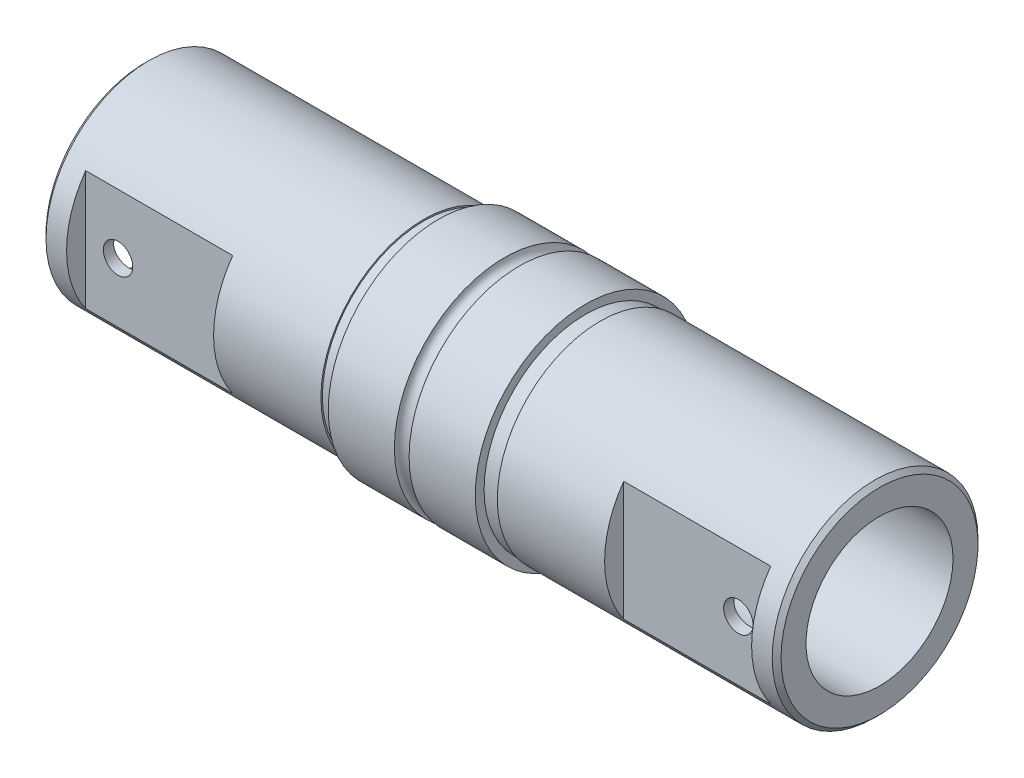
ISO-10303-21;
HEADER;
FILE_DESCRIPTION(('STEP AP214'),'2;1');
FILE_NAME('part.step','',(''),(''),'','','');
FILE_SCHEMA(('AUTOMOTIVE_DESIGN { 1 0 10303 214 1 1 1 1 }'));
ENDSEC;
DATA;
#1=APPLICATION_CONTEXT('core data for automotive mechanical design processes');
#2=APPLICATION_PROTOCOL_DEFINITION('international standard','automotive_design',2000,#1);
#3=PRODUCT_CONTEXT('',#1,'mechanical');
#4=PRODUCT('Part','Part','',(#3));
#5=PRODUCT_RELATED_PRODUCT_CATEGORY('part','',(#4));
#6=PRODUCT_DEFINITION_FORMATION('','',#4);
#7=PRODUCT_DEFINITION_CONTEXT('part definition',#1,'design');
#8=PRODUCT_DEFINITION('design','',#6,#7);
#9=PRODUCT_DEFINITION_SHAPE('','',#8);
#10=(LENGTH_UNIT() NAMED_UNIT(*) SI_UNIT(.MILLI.,.METRE.));
#11=(NAMED_UNIT(*) PLANE_ANGLE_UNIT() SI_UNIT($,.RADIAN.));
#12=(NAMED_UNIT(*) SI_UNIT($,.STERADIAN.) SOLID_ANGLE_UNIT());
#13=UNCERTAINTY_MEASURE_WITH_UNIT(LENGTH_MEASURE(1.E-05),#10,'distance_accuracy_value','');
#14=(GEOMETRIC_REPRESENTATION_CONTEXT(3) GLOBAL_UNCERTAINTY_ASSIGNED_CONTEXT((#13)) GLOBAL_UNIT_ASSIGNED_CONTEXT((#10,
#11,#12)) REPRESENTATION_CONTEXT('',''));
#15=CARTESIAN_POINT('',(0.,0.,0.));
#16=DIRECTION('',(0.,0.,1.));
#17=DIRECTION('',(1.,0.,0.));
#18=AXIS2_PLACEMENT_3D('',#15,#16,#17);
#19=CARTESIAN_POINT('',(-200.,0.,0.));
#20=DIRECTION('',(-1.,0.,0.));
#21=DIRECTION('',(0.,0.,1.));
#22=AXIS2_PLACEMENT_3D('',#19,#20,#21);
#23=CYLINDRICAL_SURFACE('',#22,35.);
#24=CARTESIAN_POINT('',(-30.,0.,0.));
#25=DIRECTION('',(-1.,0.,0.));
#26=DIRECTION('',(0.,0.,1.));
#27=AXIS2_PLACEMENT_3D('',#24,#25,#26);
#28=CIRCLE('',#27,35.);
#29=CARTESIAN_POINT('',(-30.,0.,35.));
#30=VERTEX_POINT('',#29);
#31=EDGE_CURVE('E122',#30,#30,#28,.T.);
#32=ORIENTED_EDGE('',*,*,#31,.T.);
#33=EDGE_LOOP('',(#32));
#34=FACE_BOUND('',#33,.T.);
#35=CARTESIAN_POINT('',(-123.5,0.,0.));
#36=DIRECTION('',(1.,0.,0.));
#37=DIRECTION('',(0.,0.,-1.));
#38=AXIS2_PLACEMENT_3D('',#35,#36,#37);
#39=CIRCLE('',#38,35.);
#40=CARTESIAN_POINT('',(-123.5,0.,-35.));
#41=VERTEX_POINT('',#40);
#42=EDGE_CURVE('E150',#41,#41,#39,.T.);
#43=ORIENTED_EDGE('',*,*,#42,.T.);
#44=EDGE_LOOP('',(#43));
#45=FACE_BOUND('',#44,.T.);
#46=CARTESIAN_POINT('',(-116.5,0.,0.));
#47=DIRECTION('',(-1.,0.,0.));
#48=DIRECTION('',(0.,0.,1.));
#49=AXIS2_PLACEMENT_3D('',#46,#47,#48);
#50=CIRCLE('',#49,35.);
#51=CARTESIAN_POINT('',(-116.5,-20.31624965391,28.5));
#52=VERTEX_POINT('',#51);
#53=CARTESIAN_POINT('',(-116.5,20.31624965391,28.5));
#54=VERTEX_POINT('',#53);
#55=EDGE_CURVE('E97',#52,#54,#50,.T.);
#56=ORIENTED_EDGE('',*,*,#55,.T.);
#57=DIRECTION('',(-1.,0.,0.));
#58=VECTOR('',#57,1.);
#59=CARTESIAN_POINT('',(-200.,20.31624965391,28.5));
#60=LINE('',#59,#58);
#61=CARTESIAN_POINT('',(-66.5,20.31624965391,28.5));
#62=VERTEX_POINT('',#61);
#63=EDGE_CURVE('E11',#62,#54,#60,.T.);
#64=ORIENTED_EDGE('',*,*,#63,.F.);
#65=CARTESIAN_POINT('',(-66.5,0.,0.));
#66=DIRECTION('',(-1.,0.,0.));
#67=DIRECTION('',(0.,0.,1.));
#68=AXIS2_PLACEMENT_3D('',#65,#66,#67);
#69=CIRCLE('',#68,35.);
#70=CARTESIAN_POINT('',(-66.5,-20.31624965391,28.5));
#71=VERTEX_POINT('',#70);
#72=EDGE_CURVE('E95',#71,#62,#69,.T.);
#73=ORIENTED_EDGE('',*,*,#72,.F.);
#74=DIRECTION('',(-1.,0.,0.));
#75=VECTOR('',#74,1.);
#76=CARTESIAN_POINT('',(-200.,-20.31624965391,28.5));
#77=LINE('',#76,#75);
#78=EDGE_CURVE('E41',#52,#71,#77,.F.);
#79=ORIENTED_EDGE('',*,*,#78,.F.);
#80=EDGE_LOOP('',(#56,#64,#73,#79));
#81=FACE_BOUND('',#80,.T.);
#82=ADVANCED_FACE('F33',(#34,#45,#81),#23,.T.);
#83=CARTESIAN_POINT('',(-200.,0.,0.));
#84=DIRECTION('',(-1.,0.,0.));
#85=DIRECTION('',(0.,0.,1.));
#86=AXIS2_PLACEMENT_3D('',#83,#84,#85);
#87=CYLINDRICAL_SURFACE('',#86,35.);
#88=CARTESIAN_POINT('',(30.,0.,0.));
#89=DIRECTION('',(-1.,0.,0.));
#90=DIRECTION('',(0.,0.,1.));
#91=AXIS2_PLACEMENT_3D('',#88,#89,#90);
#92=CIRCLE('',#91,35.);
#93=CARTESIAN_POINT('',(30.,0.,35.));
#94=VERTEX_POINT('',#93);
#95=EDGE_CURVE('E121',#94,#94,#92,.T.);
#96=ORIENTED_EDGE('',*,*,#95,.F.);
#97=EDGE_LOOP('',(#96));
#98=FACE_BOUND('',#97,.T.);
#99=CARTESIAN_POINT('',(123.5,0.,0.));
#100=DIRECTION('',(-1.,0.,0.));
#101=DIRECTION('',(0.,0.,1.));
#102=AXIS2_PLACEMENT_3D('',#99,#100,#101);
#103=CIRCLE('',#102,35.);
#104=CARTESIAN_POINT('',(123.5,0.,35.));
#105=VERTEX_POINT('',#104);
#106=EDGE_CURVE('E153',#105,#105,#103,.T.);
#107=ORIENTED_EDGE('',*,*,#106,.T.);
#108=EDGE_LOOP('',(#107));
#109=FACE_BOUND('',#108,.T.);
#110=DIRECTION('',(-1.,0.,0.));
#111=VECTOR('',#110,1.);
#112=CARTESIAN_POINT('',(-200.,20.31624965391,28.5));
#113=LINE('',#112,#111);
#114=CARTESIAN_POINT('',(66.5,20.31624965391,28.5));
#115=VERTEX_POINT('',#114);
#116=CARTESIAN_POINT('',(116.5,20.31624965391,28.5));
#117=VERTEX_POINT('',#116);
#118=EDGE_CURVE('E83',#115,#117,#113,.F.);
#119=ORIENTED_EDGE('',*,*,#118,.T.);
#120=CARTESIAN_POINT('',(116.5,0.,0.));
#121=DIRECTION('',(-1.,0.,0.));
#122=DIRECTION('',(0.,0.,1.));
#123=AXIS2_PLACEMENT_3D('',#120,#121,#122);
#124=CIRCLE('',#123,35.);
#125=CARTESIAN_POINT('',(116.5,-20.31624965391,28.5));
#126=VERTEX_POINT('',#125);
#127=EDGE_CURVE('E54',#126,#117,#124,.T.);
#128=ORIENTED_EDGE('',*,*,#127,.F.);
#129=DIRECTION('',(-1.,0.,0.));
#130=VECTOR('',#129,1.);
#131=CARTESIAN_POINT('',(-200.,-20.31624965391,28.5));
#132=LINE('',#131,#130);
#133=CARTESIAN_POINT('',(66.5,-20.31624965391,28.5));
#134=VERTEX_POINT('',#133);
#135=EDGE_CURVE('E75',#126,#134,#132,.T.);
#136=ORIENTED_EDGE('',*,*,#135,.T.);
#137=CARTESIAN_POINT('',(66.5,0.,0.));
#138=DIRECTION('',(-1.,0.,0.));
#139=DIRECTION('',(0.,0.,1.));
#140=AXIS2_PLACEMENT_3D('',#137,#138,#139);
#141=CIRCLE('',#140,35.);
#142=EDGE_CURVE('E88',#134,#115,#141,.T.);
#143=ORIENTED_EDGE('',*,*,#142,.T.);
#144=EDGE_LOOP('',(#119,#128,#136,#143));
#145=FACE_BOUND('',#144,.T.);
#146=ADVANCED_FACE('F87',(#98,#109,#145),#87,.T.);
#147=CARTESIAN_POINT('',(-125.,0.,-35.));
#148=DIRECTION('',(1.,0.,0.));
#149=DIRECTION('',(0.,0.,-1.));
#150=AXIS2_PLACEMENT_3D('',#147,#148,#149);
#151=PLANE('',#150);
#152=CARTESIAN_POINT('',(-125.,0.,0.));
#153=DIRECTION('',(1.,0.,0.));
#154=DIRECTION('',(0.,0.,-1.));
#155=AXIS2_PLACEMENT_3D('',#152,#153,#154);
#156=CIRCLE('',#155,25.);
#157=CARTESIAN_POINT('',(-125.,0.,-25.));
#158=VERTEX_POINT('',#157);
#159=EDGE_CURVE('E118',#158,#158,#156,.T.);
#160=ORIENTED_EDGE('',*,*,#159,.T.);
#161=EDGE_LOOP('',(#160));
#162=FACE_BOUND('',#161,.T.);
#163=CARTESIAN_POINT('',(-125.,0.,0.));
#164=DIRECTION('',(1.,0.,0.));
#165=DIRECTION('',(0.,0.,-1.));
#166=AXIS2_PLACEMENT_3D('',#163,#164,#165);
#167=CIRCLE('',#166,33.5000000000001);
#168=CARTESIAN_POINT('',(-125.,0.,-33.5000000000001));
#169=VERTEX_POINT('',#168);
#170=EDGE_CURVE('E147',#169,#169,#167,.F.);
#171=ORIENTED_EDGE('',*,*,#170,.T.);
#172=EDGE_LOOP('',(#171));
#173=FACE_BOUND('',#172,.T.);
#174=ADVANCED_FACE('F191',(#162,#173),#151,.F.);
#175=CARTESIAN_POINT('',(-125.,0.,0.));
#176=DIRECTION('',(1.,0.,0.));
#177=DIRECTION('',(0.,0.,-1.));
#178=AXIS2_PLACEMENT_3D('',#175,#176,#177);
#179=CONICAL_SURFACE('',#178,33.5000000000001,0.785398163397439);
#180=ORIENTED_EDGE('',*,*,#42,.F.);
#181=EDGE_LOOP('',(#180));
#182=FACE_BOUND('',#181,.T.);
#183=ORIENTED_EDGE('',*,*,#170,.F.);
#184=EDGE_LOOP('',(#183));
#185=FACE_BOUND('',#184,.T.);
#186=ADVANCED_FACE('F198',(#182,#185),#179,.T.);
#187=CARTESIAN_POINT('',(-200.,0.,0.));
#188=DIRECTION('',(-1.,0.,0.));
#189=DIRECTION('',(0.,0.,1.));
#190=AXIS2_PLACEMENT_3D('',#187,#188,#189);
#191=CYLINDRICAL_SURFACE('',#190,34.5);
#192=CARTESIAN_POINT('',(-25.,0.,0.));
#193=DIRECTION('',(-1.,0.,0.));
#194=DIRECTION('',(0.,0.,1.));
#195=AXIS2_PLACEMENT_3D('',#192,#193,#194);
#196=CIRCLE('',#195,34.5);
#197=CARTESIAN_POINT('',(-25.,0.,34.5));
#198=VERTEX_POINT('',#197);
#199=EDGE_CURVE('E129',#198,#198,#196,.T.);
#200=ORIENTED_EDGE('',*,*,#199,.T.);
#201=EDGE_LOOP('',(#200));
#202=FACE_BOUND('',#201,.T.);
#203=CARTESIAN_POINT('',(-30.,0.,0.));
#204=DIRECTION('',(-1.,0.,0.));
#205=DIRECTION('',(0.,0.,1.));
#206=AXIS2_PLACEMENT_3D('',#203,#204,#205);
#207=CIRCLE('',#206,34.5);
#208=CARTESIAN_POINT('',(-30.,0.,34.5));
#209=VERTEX_POINT('',#208);
#210=EDGE_CURVE('E125',#209,#209,#207,.T.);
#211=ORIENTED_EDGE('',*,*,#210,.F.);
#212=EDGE_LOOP('',(#211));
#213=FACE_BOUND('',#212,.T.);
#214=ADVANCED_FACE('F211',(#202,#213),#191,.T.);
#215=CARTESIAN_POINT('',(-30.,35.,0.));
#216=DIRECTION('',(1.,0.,0.));
#217=DIRECTION('',(0.,0.,-1.));
#218=AXIS2_PLACEMENT_3D('',#215,#216,#217);
#219=PLANE('',#218);
#220=ORIENTED_EDGE('',*,*,#210,.T.);
#221=EDGE_LOOP('',(#220));
#222=FACE_BOUND('',#221,.T.);
#223=ORIENTED_EDGE('',*,*,#31,.F.);
#224=EDGE_LOOP('',(#223));
#225=FACE_BOUND('',#224,.T.);
#226=ADVANCED_FACE('F177',(#222,#225),#219,.T.);
#227=CARTESIAN_POINT('',(-25.,0.,-37.5));
#228=DIRECTION('',(1.,0.,0.));
#229=DIRECTION('',(0.,0.,-1.));
#230=AXIS2_PLACEMENT_3D('',#227,#228,#229);
#231=PLANE('',#230);
#232=CARTESIAN_POINT('',(-25.,0.,0.));
#233=DIRECTION('',(-1.,0.,0.));
#234=DIRECTION('',(0.,0.,1.));
#235=AXIS2_PLACEMENT_3D('',#232,#233,#234);
#236=CIRCLE('',#235,37.5);
#237=CARTESIAN_POINT('',(-25.,0.,37.5));
#238=VERTEX_POINT('',#237);
#239=EDGE_CURVE('E140',#238,#238,#236,.T.);
#240=ORIENTED_EDGE('',*,*,#239,.T.);
#241=EDGE_LOOP('',(#240));
#242=FACE_BOUND('',#241,.T.);
#243=ORIENTED_EDGE('',*,*,#199,.F.);
#244=EDGE_LOOP('',(#243));
#245=FACE_BOUND('',#244,.T.);
#246=ADVANCED_FACE('F166',(#242,#245),#231,.F.);
#247=CARTESIAN_POINT('',(-200.,0.,0.));
#248=DIRECTION('',(-1.,0.,0.));
#249=DIRECTION('',(0.,0.,1.));
#250=AXIS2_PLACEMENT_3D('',#247,#248,#249);
#251=CYLINDRICAL_SURFACE('',#250,37.5);
#252=ORIENTED_EDGE('',*,*,#239,.F.);
#253=EDGE_LOOP('',(#252));
#254=FACE_BOUND('',#253,.T.);
#255=CARTESIAN_POINT('',(-2.50000000000003,0.,0.));
#256=DIRECTION('',(1.,0.,0.));
#257=DIRECTION('',(0.,0.,-1.));
#258=AXIS2_PLACEMENT_3D('',#255,#256,#257);
#259=CIRCLE('',#258,37.5);
#260=CARTESIAN_POINT('',(-2.50000000000003,0.,-37.5));
#261=VERTEX_POINT('',#260);
#262=EDGE_CURVE('E144',#261,#261,#259,.T.);
#263=ORIENTED_EDGE('',*,*,#262,.F.);
#264=EDGE_LOOP('',(#263));
#265=FACE_BOUND('',#264,.T.);
#266=ADVANCED_FACE('F164',(#254,#265),#251,.T.);
#267=CARTESIAN_POINT('',(0.,0.,0.));
#268=DIRECTION('',(-1.,0.,0.));
#269=DIRECTION('',(0.,0.,1.));
#270=AXIS2_PLACEMENT_3D('',#267,#268,#269);
#271=TOROIDAL_SURFACE('',#270,37.5,2.5);
#272=CARTESIAN_POINT('',(2.49999999999997,0.,0.));
#273=DIRECTION('',(-1.,0.,0.));
#274=DIRECTION('',(0.,0.,1.));
#275=AXIS2_PLACEMENT_3D('',#272,#273,#274);
#276=CIRCLE('',#275,37.5);
#277=CARTESIAN_POINT('',(2.49999999999997,0.,37.5));
#278=VERTEX_POINT('',#277);
#279=EDGE_CURVE('E132',#278,#278,#276,.T.);
#280=ORIENTED_EDGE('',*,*,#279,.T.);
#281=EDGE_LOOP('',(#280));
#282=FACE_BOUND('',#281,.T.);
#283=ORIENTED_EDGE('',*,*,#262,.T.);
#284=EDGE_LOOP('',(#283));
#285=FACE_BOUND('',#284,.T.);
#286=ADVANCED_FACE('F162',(#282,#285),#271,.F.);
#287=CARTESIAN_POINT('',(25.,0.,-37.5));
#288=DIRECTION('',(-1.,0.,0.));
#289=DIRECTION('',(0.,0.,1.));
#290=AXIS2_PLACEMENT_3D('',#287,#288,#289);
#291=PLANE('',#290);
#292=CARTESIAN_POINT('',(25.,0.,0.));
#293=DIRECTION('',(-1.,0.,0.));
#294=DIRECTION('',(0.,0.,1.));
#295=AXIS2_PLACEMENT_3D('',#292,#293,#294);
#296=CIRCLE('',#295,37.5);
#297=CARTESIAN_POINT('',(25.,0.,37.5));
#298=VERTEX_POINT('',#297);
#299=EDGE_CURVE('E143',#298,#298,#296,.T.);
#300=ORIENTED_EDGE('',*,*,#299,.F.);
#301=EDGE_LOOP('',(#300));
#302=FACE_BOUND('',#301,.T.);
#303=CARTESIAN_POINT('',(25.,0.,0.));
#304=DIRECTION('',(-1.,0.,0.));
#305=DIRECTION('',(0.,0.,1.));
#306=AXIS2_PLACEMENT_3D('',#303,#304,#305);
#307=CIRCLE('',#306,34.5);
#308=CARTESIAN_POINT('',(25.,0.,34.5));
#309=VERTEX_POINT('',#308);
#310=EDGE_CURVE('E126',#309,#309,#307,.T.);
#311=ORIENTED_EDGE('',*,*,#310,.T.);
#312=EDGE_LOOP('',(#311));
#313=FACE_BOUND('',#312,.T.);
#314=ADVANCED_FACE('F174',(#302,#313),#291,.F.);
#315=ORIENTED_EDGE('',*,*,#299,.T.);
#316=EDGE_LOOP('',(#315));
#317=FACE_BOUND('',#316,.T.);
#318=ORIENTED_EDGE('',*,*,#279,.F.);
#319=EDGE_LOOP('',(#318));
#320=FACE_BOUND('',#319,.T.);
#321=ADVANCED_FACE('F169',(#317,#320),#251,.T.);
#322=CARTESIAN_POINT('',(-200.,0.,0.));
#323=DIRECTION('',(-1.,0.,0.));
#324=DIRECTION('',(0.,0.,1.));
#325=AXIS2_PLACEMENT_3D('',#322,#323,#324);
#326=CYLINDRICAL_SURFACE('',#325,34.5);
#327=CARTESIAN_POINT('',(30.,0.,0.));
#328=DIRECTION('',(-1.,0.,0.));
#329=DIRECTION('',(0.,0.,1.));
#330=AXIS2_PLACEMENT_3D('',#327,#328,#329);
#331=CIRCLE('',#330,34.5);
#332=CARTESIAN_POINT('',(30.,0.,34.5));
#333=VERTEX_POINT('',#332);
#334=EDGE_CURVE('E135',#333,#333,#331,.T.);
#335=ORIENTED_EDGE('',*,*,#334,.T.);
#336=EDGE_LOOP('',(#335));
#337=FACE_BOUND('',#336,.T.);
#338=ORIENTED_EDGE('',*,*,#310,.F.);
#339=EDGE_LOOP('',(#338));
#340=FACE_BOUND('',#339,.T.);
#341=ADVANCED_FACE('F183',(#337,#340),#326,.T.);
#342=CARTESIAN_POINT('',(30.,35.,0.));
#343=DIRECTION('',(-1.,0.,0.));
#344=DIRECTION('',(0.,0.,1.));
#345=AXIS2_PLACEMENT_3D('',#342,#343,#344);
#346=PLANE('',#345);
#347=ORIENTED_EDGE('',*,*,#95,.T.);
#348=EDGE_LOOP('',(#347));
#349=FACE_BOUND('',#348,.T.);
#350=ORIENTED_EDGE('',*,*,#334,.F.);
#351=EDGE_LOOP('',(#350));
#352=FACE_BOUND('',#351,.T.);
#353=ADVANCED_FACE('F202',(#349,#352),#346,.T.);
#354=CARTESIAN_POINT('',(125.,0.,-35.));
#355=DIRECTION('',(-1.,0.,0.));
#356=DIRECTION('',(0.,0.,1.));
#357=AXIS2_PLACEMENT_3D('',#354,#355,#356);
#358=PLANE('',#357);
#359=CARTESIAN_POINT('',(125.,0.,0.));
#360=DIRECTION('',(1.,0.,0.));
#361=DIRECTION('',(0.,0.,-1.));
#362=AXIS2_PLACEMENT_3D('',#359,#360,#361);
#363=CIRCLE('',#362,25.);
#364=CARTESIAN_POINT('',(125.,0.,-25.));
#365=VERTEX_POINT('',#364);
#366=EDGE_CURVE('E115',#365,#365,#363,.T.);
#367=ORIENTED_EDGE('',*,*,#366,.F.);
#368=EDGE_LOOP('',(#367));
#369=FACE_BOUND('',#368,.T.);
#370=CARTESIAN_POINT('',(125.,0.,0.));
#371=DIRECTION('',(-1.,0.,0.));
#372=DIRECTION('',(0.,0.,1.));
#373=AXIS2_PLACEMENT_3D('',#370,#371,#372);
#374=CIRCLE('',#373,33.5);
#375=CARTESIAN_POINT('',(125.,0.,33.5));
#376=VERTEX_POINT('',#375);
#377=EDGE_CURVE('E90',#376,#376,#374,.F.);
#378=ORIENTED_EDGE('',*,*,#377,.T.);
#379=EDGE_LOOP('',(#378));
#380=FACE_BOUND('',#379,.T.);
#381=ADVANCED_FACE('F200',(#369,#380),#358,.F.);
#382=CARTESIAN_POINT('',(123.5,0.,0.));
#383=DIRECTION('',(-1.,0.,0.));
#384=DIRECTION('',(0.,0.,1.));
#385=AXIS2_PLACEMENT_3D('',#382,#383,#384);
#386=CONICAL_SURFACE('',#385,35.,0.785398163397439);
#387=ORIENTED_EDGE('',*,*,#377,.F.);
#388=EDGE_LOOP('',(#387));
#389=FACE_BOUND('',#388,.T.);
#390=ORIENTED_EDGE('',*,*,#106,.F.);
#391=EDGE_LOOP('',(#390));
#392=FACE_BOUND('',#391,.T.);
#393=ADVANCED_FACE('F35',(#389,#392),#386,.T.);
#394=CARTESIAN_POINT('',(-175.,0.,0.));
#395=DIRECTION('',(1.,0.,0.));
#396=DIRECTION('',(0.,0.,-1.));
#397=AXIS2_PLACEMENT_3D('',#394,#395,#396);
#398=CYLINDRICAL_SURFACE('',#397,25.);
#399=CARTESIAN_POINT('',(-100.5,0.,25.));
#400=CARTESIAN_POINT('',(-100.499997230554,0.138987493787324,25.0000014065203));
#401=CARTESIAN_POINT('',(-100.505796750719,0.277940302046088,24.9988389427216));
#402=CARTESIAN_POINT('',(-100.528943648703,0.554886864496205,24.994224565157));
#403=CARTESIAN_POINT('',(-100.546293205103,0.692880432791919,24.9907722194715));
#404=CARTESIAN_POINT('',(-100.592418562288,0.966937148503881,24.981670242636));
#405=CARTESIAN_POINT('',(-100.621200154486,1.10299928122357,24.9760194978176));
#406=CARTESIAN_POINT('',(-100.689974650891,1.37221108352448,24.9626762565998));
#407=CARTESIAN_POINT('',(-100.729971676222,1.50535966309261,24.9549830097359));
#408=CARTESIAN_POINT('',(-100.820803747742,1.76758319373794,24.9377804442932));
#409=CARTESIAN_POINT('',(-100.871624170215,1.896663374225,24.9282735779222));
#410=CARTESIAN_POINT('',(-100.983775982188,2.15009997814348,24.9076944208426));
#411=CARTESIAN_POINT('',(-101.045111247659,2.2744546389337,24.8966215531404));
#412=CARTESIAN_POINT('',(-101.177805430709,2.51749782000809,24.8732206370355));
#413=CARTESIAN_POINT('',(-101.249159858294,2.63618884664851,24.8608931515555));
#414=CARTESIAN_POINT('',(-101.401439635248,2.86722020463685,24.8353088041128));
#415=CARTESIAN_POINT('',(-101.482368557535,2.97955814193969,24.8220515959613));
#416=CARTESIAN_POINT('',(-101.65422880683,3.1983785388143,24.7948114657324));
#417=CARTESIAN_POINT('',(-101.745266643354,3.30477652475172,24.780821838943));
#418=CARTESIAN_POINT('',(-101.935962332035,3.50958996762925,24.7526457290753));
#419=CARTESIAN_POINT('',(-102.035623365918,3.60800245195942,24.738459174971));
#420=CARTESIAN_POINT('',(-102.242834435926,3.7961092760484,24.7102933832022));
#421=CARTESIAN_POINT('',(-102.350382188763,3.88580612172818,24.6963140869323));
#422=CARTESIAN_POINT('',(-102.572707165458,4.05592901668138,24.6689453876667));
#423=CARTESIAN_POINT('',(-102.687487041164,4.13635163435981,24.6555562041458));
#424=CARTESIAN_POINT('',(-102.92451584315,4.28798741229219,24.6296394657581));
#425=CARTESIAN_POINT('',(-103.046821344988,4.35911381454495,24.6171204770982));
#426=CARTESIAN_POINT('',(-103.297128747124,4.49081269831454,24.5934353082732));
#427=CARTESIAN_POINT('',(-103.425132761988,4.55138122040544,24.5822696361062));
#428=CARTESIAN_POINT('',(-103.816258356143,4.71644727257976,24.5513304070068));
#429=CARTESIAN_POINT('',(-104.086780675394,4.80448882604821,24.5340820165952));
#430=CARTESIAN_POINT('',(-104.635461434794,4.93264780265691,24.508635793463));
#431=CARTESIAN_POINT('',(-104.913473329707,4.97337819482265,24.5003223072134));
#432=CARTESIAN_POINT('',(-105.472538498876,5.00775493418216,24.4933199482487));
#433=CARTESIAN_POINT('',(-105.75359145921,5.00140609582258,24.4946300913956));
#434=CARTESIAN_POINT('',(-106.306236719929,4.94227436036826,24.5066272442008));
#435=CARTESIAN_POINT('',(-106.577907773174,4.89019310186595,24.5171725589932));
#436=CARTESIAN_POINT('',(-107.108579638242,4.7421890224497,24.546227391949));
#437=CARTESIAN_POINT('',(-107.36757984432,4.64626410780486,24.5647372904543));
#438=CARTESIAN_POINT('',(-107.867576510147,4.41262402680007,24.6077809023025));
#439=CARTESIAN_POINT('',(-108.108439451908,4.27463078523215,24.632354484594));
#440=CARTESIAN_POINT('',(-108.563854195796,3.96096784378849,24.684730944745));
#441=CARTESIAN_POINT('',(-108.778402969647,3.78529381392922,24.7125341935642));
#442=CARTESIAN_POINT('',(-109.179147027156,3.39749968079915,24.7688510603976));
#443=CARTESIAN_POINT('',(-109.364762843287,3.18478080820447,24.797368460096));
#444=CARTESIAN_POINT('',(-109.697769227515,2.73092511816779,24.8514424361697));
#445=CARTESIAN_POINT('',(-109.845159305376,2.48978793632426,24.8769989745701));
#446=CARTESIAN_POINT('',(-110.097637547223,1.98529693496818,24.9223345079227));
#447=CARTESIAN_POINT('',(-110.202659468597,1.72190909807365,24.9421044423773));
#448=CARTESIAN_POINT('',(-110.366802369819,1.18074488209619,24.9735704494292));
#449=CARTESIAN_POINT('',(-110.425928909964,0.902970250347202,24.98526750005));
#450=CARTESIAN_POINT('',(-110.495782269369,0.345897028150552,24.9991335933204));
#451=CARTESIAN_POINT('',(-110.507302098915,0.0667016415443254,25.0014587325673));
#452=CARTESIAN_POINT('',(-110.483750704076,-0.489624670880016,24.9967525965614));
#453=CARTESIAN_POINT('',(-110.44868209878,-0.766755711869967,24.9897218472742));
#454=CARTESIAN_POINT('',(-110.333608136697,-1.30852830007856,24.9671916002008));
#455=CARTESIAN_POINT('',(-110.254009673906,-1.57325974299468,24.9517688194687));
#456=CARTESIAN_POINT('',(-110.052580070325,-2.08561813620307,24.9141776037933));
#457=CARTESIAN_POINT('',(-109.930745765445,-2.33324380335236,24.892008663478));
#458=CARTESIAN_POINT('',(-109.646587608663,-2.80770587332563,24.8429955738642));
#459=CARTESIAN_POINT('',(-109.483786327199,-3.03425065213175,24.8160975113418));
#460=CARTESIAN_POINT('',(-109.122953811544,-3.45709007722326,24.760736752006));
#461=CARTESIAN_POINT('',(-108.924918800207,-3.65338147605436,24.7322738876682));
#462=CARTESIAN_POINT('',(-108.495634121552,-4.01320302351496,24.6764651380018));
#463=CARTESIAN_POINT('',(-108.263924590205,-4.17618877400405,24.6491428619003));
#464=CARTESIAN_POINT('',(-107.775939882037,-4.46092683850575,24.5992097395686));
#465=CARTESIAN_POINT('',(-107.519665688617,-4.5826808022728,24.5765987048474));
#466=CARTESIAN_POINT('',(-106.991171067746,-4.78076018011429,24.5388364729789));
#467=CARTESIAN_POINT('',(-106.719041582143,-4.85732111853824,24.5236466726876));
#468=CARTESIAN_POINT('',(-106.165286950416,-4.96353963899986,24.5023739077135));
#469=CARTESIAN_POINT('',(-105.883663047478,-4.9932033375265,24.4962897554484));
#470=CARTESIAN_POINT('',(-105.463329611045,-5.00179339144585,24.4945288792509));
#471=CARTESIAN_POINT('',(-105.324773431851,-4.99885021968412,24.4951330184965));
#472=CARTESIAN_POINT('',(-105.048426204286,-4.98148651470878,24.4986714739674));
#473=CARTESIAN_POINT('',(-104.910634885525,-4.9670703371849,24.5016049058833));
#474=CARTESIAN_POINT('',(-104.636750984081,-4.92686276339317,24.5097212135577));
#475=CARTESIAN_POINT('',(-104.500659013031,-4.90106738632089,24.5149048765081));
#476=CARTESIAN_POINT('',(-104.23122009426,-4.83831799577184,24.5273664043086));
#477=CARTESIAN_POINT('',(-104.097872185316,-4.80136796328246,24.5346435219816));
#478=CARTESIAN_POINT('',(-103.835077299433,-4.71667811844351,24.5510651803018));
#479=CARTESIAN_POINT('',(-103.705622754699,-4.66896100938054,24.5602057877658));
#480=CARTESIAN_POINT('',(-103.451248303595,-4.56306801677477,24.5800998692381));
#481=CARTESIAN_POINT('',(-103.326326811545,-4.5048958336854,24.5908527723703));
#482=CARTESIAN_POINT('',(-103.081752437273,-4.37847423732261,24.6136768592635));
#483=CARTESIAN_POINT('',(-102.962101768228,-4.31022064232976,24.6257485895239));
#484=CARTESIAN_POINT('',(-102.728950754505,-4.1641570153785,24.6508678052533));
#485=CARTESIAN_POINT('',(-102.615448318297,-4.08635026305033,24.6639149552593));
#486=CARTESIAN_POINT('',(-102.393373264701,-3.92025868558203,24.6908640955351));
#487=CARTESIAN_POINT('',(-102.284920460293,-3.83181538764857,24.7047769949563));
#488=CARTESIAN_POINT('',(-102.075861703643,-3.6462048401506,24.7328525343466));
#489=CARTESIAN_POINT('',(-101.975253008346,-3.54904066604526,24.7470150848702));
#490=CARTESIAN_POINT('',(-101.782459379197,-3.34655721556743,24.7752095204235));
#491=CARTESIAN_POINT('',(-101.690279468224,-3.24123314471886,24.7892413231228));
#492=CARTESIAN_POINT('',(-101.515073059973,-3.02322778921368,24.8167717117019));
#493=CARTESIAN_POINT('',(-101.432043206753,-2.91054922625044,24.8302704919035));
#494=CARTESIAN_POINT('',(-101.274826102885,-2.67729343786965,24.8565085935593));
#495=CARTESIAN_POINT('',(-101.20074476894,-2.55664367436167,24.869238066002));
#496=CARTESIAN_POINT('',(-101.063055664783,-2.30944481023433,24.8934104051449));
#497=CARTESIAN_POINT('',(-100.999444048686,-2.18289789785573,24.9048537437938));
#498=CARTESIAN_POINT('',(-100.8831754965,-1.9248233263731,24.9261268452451));
#499=CARTESIAN_POINT('',(-100.8305119297,-1.79329873940674,24.9359575839567));
#500=CARTESIAN_POINT('',(-100.736512319287,-1.5261844247676,24.9537310452209));
#501=CARTESIAN_POINT('',(-100.695174093379,-1.39059548585458,24.9616741314688));
#502=CARTESIAN_POINT('',(-100.606776872803,-1.04920215690347,24.9788087281562));
#503=CARTESIAN_POINT('',(-100.566790189284,-0.841457494405879,24.9867141903289));
#504=CARTESIAN_POINT('',(-100.513404280581,-0.42244845328069,24.9973086745575));
#505=CARTESIAN_POINT('',(-100.500004208028,-0.211184187046264,24.9999978628663));
#506=CARTESIAN_POINT('',(-100.5,0.,25.));
#507=B_SPLINE_CURVE_WITH_KNOTS('',3,(#399,#400,#401,#402,#403,#404,#405,#406,#407,#408,#409,
#410,#411,#412,#413,#414,#415,#416,#417,#418,#419,#420,#421,#422,#423,#424,#425,#426,#427,#428,
#429,#430,#431,#432,#433,#434,#435,#436,#437,#438,#439,#440,#441,#442,#443,#444,#445,#446,#447,
#448,#449,#450,#451,#452,#453,#454,#455,#456,#457,#458,#459,#460,#461,#462,#463,#464,#465,#466,
#467,#468,#469,#470,#471,#472,#473,#474,#475,#476,#477,#478,#479,#480,#481,#482,#483,#484,#485,
#486,#487,#488,#489,#490,#491,#492,#493,#494,#495,#496,#497,#498,#499,#500,#501,#502,#503,#504,
#505,#506),.UNSPECIFIED.,.T.,.F.,(4,2,2,2,2,2,2,2,2,2,2,2,2,2,2,2,2,2,2,2,2,2,2,2,2,2,2,2,2,2,2,
2,2,2,2,2,2,2,2,2,2,2,2,2,2,2,2,2,2,2,2,2,2,4),(0.,0.416777047445418,0.833632730149865,
1.25069985977207,1.66792044248879,2.08458084615619,2.50139517036217,2.91802329572164,
3.33480738770838,3.7564966440872,4.17834216132242,4.60006602836889,5.02194544187044,
5.44751701120413,5.87324783701271,6.72369555497645,7.56299734191931,8.40221330082508,
9.22877443707776,10.0553750494503,10.8875625969435,11.7198458242473,12.5671007113314,
13.4143664637548,14.262951829465,15.1114343716656,15.9457248705771,16.7799684696572,
17.6067107843,18.4335150475649,19.2704413884318,20.1074575040603,20.9572195157251,
21.8069475229372,22.6522071384191,23.4973565033242,23.9127168808878,24.3279196434016,
24.7432677723234,25.1584678424529,25.5728004765727,25.9869867501796,26.4013453111814,
26.8155620171985,27.2369706991648,27.6582313488923,28.0797414220244,28.501096380851,
28.9270309561325,29.3528087202144,29.7783278548953,30.203764937947,30.8370559265658,
31.4703267306209),.UNSPECIFIED.);
#508=CARTESIAN_POINT('',(-100.5,0.,25.));
#509=VERTEX_POINT('',#508);
#510=EDGE_CURVE('E226',#509,#509,#507,.T.);
#511=ORIENTED_EDGE('',*,*,#510,.T.);
#512=EDGE_LOOP('',(#511));
#513=FACE_BOUND('',#512,.T.);
#514=CARTESIAN_POINT('',(110.5,0.,25.));
#515=CARTESIAN_POINT('',(110.500002769446,0.138987493787324,25.0000014065203));
#516=CARTESIAN_POINT('',(110.494203249281,0.277940302046088,24.9988389427216));
#517=CARTESIAN_POINT('',(110.471056351297,0.554886864496205,24.994224565157));
#518=CARTESIAN_POINT('',(110.453706794897,0.692880432791919,24.9907722194715));
#519=CARTESIAN_POINT('',(110.407581437712,0.966937148503881,24.981670242636));
#520=CARTESIAN_POINT('',(110.378799845514,1.10299928122357,24.9760194978176));
#521=CARTESIAN_POINT('',(110.310025349109,1.37221108352448,24.9626762565998));
#522=CARTESIAN_POINT('',(110.270028323778,1.50535966309261,24.9549830097359));
#523=CARTESIAN_POINT('',(110.179196252258,1.76758319373794,24.9377804442932));
#524=CARTESIAN_POINT('',(110.128375829785,1.896663374225,24.9282735779222));
#525=CARTESIAN_POINT('',(110.016224017812,2.15009997814348,24.9076944208426));
#526=CARTESIAN_POINT('',(109.954888752341,2.2744546389337,24.8966215531404));
#527=CARTESIAN_POINT('',(109.822194569291,2.51749782000809,24.8732206370355));
#528=CARTESIAN_POINT('',(109.750840141706,2.63618884664851,24.8608931515555));
#529=CARTESIAN_POINT('',(109.598560364752,2.86722020463685,24.8353088041128));
#530=CARTESIAN_POINT('',(109.517631442465,2.97955814193969,24.8220515959613));
#531=CARTESIAN_POINT('',(109.34577119317,3.1983785388143,24.7948114657324));
#532=CARTESIAN_POINT('',(109.254733356646,3.30477652475172,24.780821838943));
#533=CARTESIAN_POINT('',(109.064037667965,3.50958996762925,24.7526457290753));
#534=CARTESIAN_POINT('',(108.964376634082,3.60800245195942,24.738459174971));
#535=CARTESIAN_POINT('',(108.757165564074,3.79610927604841,24.7102933832022));
#536=CARTESIAN_POINT('',(108.649617811237,3.88580612172819,24.6963140869323));
#537=CARTESIAN_POINT('',(108.427292834542,4.05592901668139,24.6689453876667));
#538=CARTESIAN_POINT('',(108.312512958836,4.13635163435982,24.6555562041458));
#539=CARTESIAN_POINT('',(108.07548415685,4.2879874122922,24.6296394657581));
#540=CARTESIAN_POINT('',(107.953178655012,4.35911381454495,24.6171204770982));
#541=CARTESIAN_POINT('',(107.702871252876,4.49081269831454,24.5934353082732));
#542=CARTESIAN_POINT('',(107.574867238012,4.55138122040544,24.5822696361062));
#543=CARTESIAN_POINT('',(107.183741643857,4.71644727257976,24.5513304070068));
#544=CARTESIAN_POINT('',(106.913219324606,4.80448882604821,24.5340820165952));
#545=CARTESIAN_POINT('',(106.364538565206,4.93264780265691,24.508635793463));
#546=CARTESIAN_POINT('',(106.086526670293,4.97337819482265,24.5003223072134));
#547=CARTESIAN_POINT('',(105.527461501124,5.00775493418216,24.4933199482487));
#548=CARTESIAN_POINT('',(105.24640854079,5.00140609582258,24.4946300913956));
#549=CARTESIAN_POINT('',(104.693763280071,4.94227436036826,24.5066272442008));
#550=CARTESIAN_POINT('',(104.422092226826,4.89019310186595,24.5171725589932));
#551=CARTESIAN_POINT('',(103.891420361758,4.7421890224497,24.546227391949));
#552=CARTESIAN_POINT('',(103.63242015568,4.64626410780486,24.5647372904543));
#553=CARTESIAN_POINT('',(103.132423489853,4.41262402680007,24.6077809023025));
#554=CARTESIAN_POINT('',(102.891560548092,4.27463078523215,24.632354484594));
#555=CARTESIAN_POINT('',(102.436145804204,3.96096784378849,24.684730944745));
#556=CARTESIAN_POINT('',(102.221597030353,3.78529381392922,24.7125341935642));
#557=CARTESIAN_POINT('',(101.820852972844,3.39749968079915,24.7688510603976));
#558=CARTESIAN_POINT('',(101.635237156713,3.18478080820446,24.797368460096));
#559=CARTESIAN_POINT('',(101.302230772485,2.73092511816778,24.8514424361697));
#560=CARTESIAN_POINT('',(101.154840694624,2.48978793632426,24.8769989745701));
#561=CARTESIAN_POINT('',(100.902362452777,1.98529693496818,24.9223345079227));
#562=CARTESIAN_POINT('',(100.797340531403,1.72190909807365,24.9421044423773));
#563=CARTESIAN_POINT('',(100.633197630181,1.18074488209619,24.9735704494292));
#564=CARTESIAN_POINT('',(100.574071090036,0.902970250347202,24.98526750005));
#565=CARTESIAN_POINT('',(100.504217730631,0.345897028150552,24.9991335933204));
#566=CARTESIAN_POINT('',(100.492697901085,0.0667016415443253,25.0014587325673));
#567=CARTESIAN_POINT('',(100.516249295924,-0.489624670880016,24.9967525965614));
#568=CARTESIAN_POINT('',(100.55131790122,-0.766755711869967,24.9897218472742));
#569=CARTESIAN_POINT('',(100.666391863303,-1.30852830007857,24.9671916002008));
#570=CARTESIAN_POINT('',(100.745990326094,-1.57325974299469,24.9517688194687));
#571=CARTESIAN_POINT('',(100.947419929675,-2.08561813620308,24.9141776037933));
#572=CARTESIAN_POINT('',(101.069254234555,-2.33324380335236,24.892008663478));
#573=CARTESIAN_POINT('',(101.353412391337,-2.80770587332563,24.8429955738642));
#574=CARTESIAN_POINT('',(101.516213672801,-3.03425065213175,24.8160975113418));
#575=CARTESIAN_POINT('',(101.877046188455,-3.45709007722327,24.760736752006));
#576=CARTESIAN_POINT('',(102.075081199793,-3.65338147605436,24.7322738876682));
#577=CARTESIAN_POINT('',(102.504365878448,-4.01320302351496,24.6764651380018));
#578=CARTESIAN_POINT('',(102.736075409795,-4.17618877400405,24.6491428619003));
#579=CARTESIAN_POINT('',(103.224060117963,-4.46092683850575,24.5992097395686));
#580=CARTESIAN_POINT('',(103.480334311383,-4.5826808022728,24.5765987048474));
#581=CARTESIAN_POINT('',(104.008828932254,-4.7807601801143,24.5388364729789));
#582=CARTESIAN_POINT('',(104.280958417857,-4.85732111853824,24.5236466726876));
#583=CARTESIAN_POINT('',(104.834713049584,-4.96353963899986,24.5023739077135));
#584=CARTESIAN_POINT('',(105.116336952522,-4.9932033375265,24.4962897554484));
#585=CARTESIAN_POINT('',(105.536670388955,-5.00179339144585,24.4945288792509));
#586=CARTESIAN_POINT('',(105.675226568149,-4.99885021968412,24.4951330184965));
#587=CARTESIAN_POINT('',(105.951573795714,-4.98148651470878,24.4986714739674));
#588=CARTESIAN_POINT('',(106.089365114475,-4.9670703371849,24.5016049058833));
#589=CARTESIAN_POINT('',(106.363249015919,-4.92686276339316,24.5097212135577));
#590=CARTESIAN_POINT('',(106.499340986969,-4.90106738632089,24.5149048765081));
#591=CARTESIAN_POINT('',(106.76877990574,-4.83831799577184,24.5273664043086));
#592=CARTESIAN_POINT('',(106.902127814684,-4.80136796328246,24.5346435219816));
#593=CARTESIAN_POINT('',(107.164922700567,-4.71667811844351,24.5510651803018));
#594=CARTESIAN_POINT('',(107.294377245301,-4.66896100938054,24.5602057877658));
#595=CARTESIAN_POINT('',(107.548751696405,-4.56306801677477,24.5800998692381));
#596=CARTESIAN_POINT('',(107.673673188455,-4.5048958336854,24.5908527723703));
#597=CARTESIAN_POINT('',(107.918247562727,-4.37847423732261,24.6136768592635));
#598=CARTESIAN_POINT('',(108.037898231772,-4.31022064232976,24.6257485895239));
#599=CARTESIAN_POINT('',(108.271049245495,-4.1641570153785,24.6508678052533));
#600=CARTESIAN_POINT('',(108.384551681703,-4.08635026305033,24.6639149552593));
#601=CARTESIAN_POINT('',(108.606626735299,-3.92025868558203,24.6908640955351));
#602=CARTESIAN_POINT('',(108.715079539707,-3.83181538764857,24.7047769949563));
#603=CARTESIAN_POINT('',(108.924138296357,-3.6462048401506,24.7328525343466));
#604=CARTESIAN_POINT('',(109.024746991654,-3.54904066604526,24.7470150848702));
#605=CARTESIAN_POINT('',(109.217540620803,-3.34655721556743,24.7752095204235));
#606=CARTESIAN_POINT('',(109.309720531776,-3.24123314471886,24.7892413231228));
#607=CARTESIAN_POINT('',(109.484926940027,-3.02322778921368,24.8167717117019));
#608=CARTESIAN_POINT('',(109.567956793247,-2.91054922625044,24.8302704919035));
#609=CARTESIAN_POINT('',(109.725173897115,-2.67729343786965,24.8565085935593));
#610=CARTESIAN_POINT('',(109.79925523106,-2.55664367436167,24.869238066002));
#611=CARTESIAN_POINT('',(109.936944335217,-2.30944481023433,24.8934104051449));
#612=CARTESIAN_POINT('',(110.000555951314,-2.18289789785573,24.9048537437938));
#613=CARTESIAN_POINT('',(110.1168245035,-1.9248233263731,24.9261268452451));
#614=CARTESIAN_POINT('',(110.1694880703,-1.79329873940675,24.9359575839567));
#615=CARTESIAN_POINT('',(110.263487680713,-1.52618442476761,24.9537310452209));
#616=CARTESIAN_POINT('',(110.304825906621,-1.39059548585458,24.9616741314688));
#617=CARTESIAN_POINT('',(110.393223127197,-1.04920215690347,24.9788087281562));
#618=CARTESIAN_POINT('',(110.433209810716,-0.84145749440588,24.9867141903289));
#619=CARTESIAN_POINT('',(110.486595719419,-0.422448453280692,24.9973086745575));
#620=CARTESIAN_POINT('',(110.499995791972,-0.211184187046265,24.9999978628663));
#621=CARTESIAN_POINT('',(110.5,0.,25.));
#622=B_SPLINE_CURVE_WITH_KNOTS('',3,(#514,#515,#516,#517,#518,#519,#520,#521,#522,#523,#524,
#525,#526,#527,#528,#529,#530,#531,#532,#533,#534,#535,#536,#537,#538,#539,#540,#541,#542,#543,
#544,#545,#546,#547,#548,#549,#550,#551,#552,#553,#554,#555,#556,#557,#558,#559,#560,#561,#562,
#563,#564,#565,#566,#567,#568,#569,#570,#571,#572,#573,#574,#575,#576,#577,#578,#579,#580,#581,
#582,#583,#584,#585,#586,#587,#588,#589,#590,#591,#592,#593,#594,#595,#596,#597,#598,#599,#600,
#601,#602,#603,#604,#605,#606,#607,#608,#609,#610,#611,#612,#613,#614,#615,#616,#617,#618,#619,
#620,#621),.UNSPECIFIED.,.T.,.F.,(4,2,2,2,2,2,2,2,2,2,2,2,2,2,2,2,2,2,2,2,2,2,2,2,2,2,2,2,2,2,2,
2,2,2,2,2,2,2,2,2,2,2,2,2,2,2,2,2,2,2,2,2,2,4),(0.,0.416777047445418,0.833632730149865,
1.25069985977207,1.66792044248879,2.08458084615619,2.50139517036217,2.91802329572164,
3.33480738770838,3.7564966440872,4.17834216132242,4.60006602836892,5.02194544187044,
5.44751701120413,5.87324783701271,6.72369555497645,7.56299734191931,8.40221330082508,
9.22877443707776,10.0553750494503,10.8875625969435,11.7198458242473,12.5671007113314,
13.4143664637548,14.262951829465,15.1114343716656,15.9457248705771,16.7799684696572,
17.6067107843,18.4335150475649,19.2704413884318,20.1074575040603,20.9572195157251,
21.8069475229372,22.6522071384191,23.4973565033242,23.9127168808878,24.3279196434016,
24.7432677723234,25.1584678424529,25.5728004765727,25.9869867501796,26.4013453111814,
26.8155620171985,27.2369706991648,27.6582313488923,28.0797414220244,28.501096380851,
28.9270309561325,29.3528087202144,29.7783278548953,30.203764937947,30.8370559265658,
31.4703267306209),.UNSPECIFIED.);
#623=CARTESIAN_POINT('',(110.5,0.,25.));
#624=VERTEX_POINT('',#623);
#625=EDGE_CURVE('E108',#624,#624,#622,.T.);
#626=ORIENTED_EDGE('',*,*,#625,.T.);
#627=EDGE_LOOP('',(#626));
#628=FACE_BOUND('',#627,.T.);
#629=ORIENTED_EDGE('',*,*,#366,.T.);
#630=EDGE_LOOP('',(#629));
#631=FACE_BOUND('',#630,.T.);
#632=ORIENTED_EDGE('',*,*,#159,.F.);
#633=EDGE_LOOP('',(#632));
#634=FACE_BOUND('',#633,.T.);
#635=ADVANCED_FACE('F218',(#513,#628,#631,#634),#398,.F.);
#636=CARTESIAN_POINT('',(116.5,25.,28.5));
#637=DIRECTION('',(-1.,0.,0.));
#638=DIRECTION('',(0.,0.,1.));
#639=AXIS2_PLACEMENT_3D('',#636,#637,#638);
#640=PLANE('',#639);
#641=ORIENTED_EDGE('',*,*,#127,.T.);
#642=DIRECTION('',(0.,-1.,0.));
#643=VECTOR('',#642,1.);
#644=CARTESIAN_POINT('',(116.5,25.,28.5));
#645=LINE('',#644,#643);
#646=EDGE_CURVE('E78',#117,#126,#645,.T.);
#647=ORIENTED_EDGE('',*,*,#646,.T.);
#648=EDGE_LOOP('',(#641,#647));
#649=FACE_BOUND('',#648,.T.);
#650=ADVANCED_FACE('F85',(#649),#640,.T.);
#651=CARTESIAN_POINT('',(66.5,25.,28.5));
#652=DIRECTION('',(-1.,0.,0.));
#653=DIRECTION('',(0.,0.,1.));
#654=AXIS2_PLACEMENT_3D('',#651,#652,#653);
#655=PLANE('',#654);
#656=ORIENTED_EDGE('',*,*,#142,.F.);
#657=DIRECTION('',(0.,-1.,0.));
#658=VECTOR('',#657,1.);
#659=CARTESIAN_POINT('',(66.5,25.,28.5));
#660=LINE('',#659,#658);
#661=EDGE_CURVE('E81',#115,#134,#660,.T.);
#662=ORIENTED_EDGE('',*,*,#661,.F.);
#663=EDGE_LOOP('',(#656,#662));
#664=FACE_BOUND('',#663,.T.);
#665=ADVANCED_FACE('F247',(#664),#655,.F.);
#666=CARTESIAN_POINT('',(0.,0.,28.5));
#667=DIRECTION('',(0.,0.,-1.));
#668=DIRECTION('',(-1.,0.,0.));
#669=AXIS2_PLACEMENT_3D('',#666,#667,#668);
#670=PLANE('',#669);
#671=CARTESIAN_POINT('',(105.5,0.,28.5));
#672=DIRECTION('',(0.,0.,1.));
#673=DIRECTION('',(1.,0.,0.));
#674=AXIS2_PLACEMENT_3D('',#671,#672,#673);
#675=CIRCLE('',#674,5.);
#676=CARTESIAN_POINT('',(110.5,0.,28.5));
#677=VERTEX_POINT('',#676);
#678=EDGE_CURVE('E267',#677,#677,#675,.T.);
#679=ORIENTED_EDGE('',*,*,#678,.F.);
#680=EDGE_LOOP('',(#679));
#681=FACE_BOUND('',#680,.T.);
#682=ORIENTED_EDGE('',*,*,#646,.F.);
#683=ORIENTED_EDGE('',*,*,#118,.F.);
#684=ORIENTED_EDGE('',*,*,#661,.T.);
#685=ORIENTED_EDGE('',*,*,#135,.F.);
#686=EDGE_LOOP('',(#682,#683,#684,#685));
#687=FACE_BOUND('',#686,.T.);
#688=ADVANCED_FACE('F76',(#681,#687),#670,.F.);
#689=CARTESIAN_POINT('',(-116.5,25.,28.5));
#690=DIRECTION('',(-1.,0.,0.));
#691=DIRECTION('',(0.,0.,1.));
#692=AXIS2_PLACEMENT_3D('',#689,#690,#691);
#693=PLANE('',#692);
#694=ORIENTED_EDGE('',*,*,#55,.F.);
#695=DIRECTION('',(0.,-1.,0.));
#696=VECTOR('',#695,1.);
#697=CARTESIAN_POINT('',(-116.5,25.,28.5));
#698=LINE('',#697,#696);
#699=EDGE_CURVE('E47',#54,#52,#698,.T.);
#700=ORIENTED_EDGE('',*,*,#699,.F.);
#701=EDGE_LOOP('',(#694,#700));
#702=FACE_BOUND('',#701,.T.);
#703=ADVANCED_FACE('F111',(#702),#693,.F.);
#704=CARTESIAN_POINT('',(-66.5,25.,28.5));
#705=DIRECTION('',(-1.,0.,0.));
#706=DIRECTION('',(0.,0.,1.));
#707=AXIS2_PLACEMENT_3D('',#704,#705,#706);
#708=PLANE('',#707);
#709=ORIENTED_EDGE('',*,*,#72,.T.);
#710=DIRECTION('',(0.,-1.,0.));
#711=VECTOR('',#710,1.);
#712=CARTESIAN_POINT('',(-66.5,25.,28.5));
#713=LINE('',#712,#711);
#714=EDGE_CURVE('E102',#62,#71,#713,.T.);
#715=ORIENTED_EDGE('',*,*,#714,.T.);
#716=EDGE_LOOP('',(#709,#715));
#717=FACE_BOUND('',#716,.T.);
#718=ADVANCED_FACE('F107',(#717),#708,.T.);
#719=CARTESIAN_POINT('',(0.,0.,28.5));
#720=DIRECTION('',(0.,0.,1.));
#721=DIRECTION('',(1.,0.,0.));
#722=AXIS2_PLACEMENT_3D('',#719,#720,#721);
#723=PLANE('',#722);
#724=CARTESIAN_POINT('',(-105.5,0.,28.5));
#725=DIRECTION('',(0.,0.,1.));
#726=DIRECTION('',(1.,0.,0.));
#727=AXIS2_PLACEMENT_3D('',#724,#725,#726);
#728=CIRCLE('',#727,5.);
#729=CARTESIAN_POINT('',(-100.5,0.,28.5));
#730=VERTEX_POINT('',#729);
#731=EDGE_CURVE('E266',#730,#730,#728,.T.);
#732=ORIENTED_EDGE('',*,*,#731,.F.);
#733=EDGE_LOOP('',(#732));
#734=FACE_BOUND('',#733,.T.);
#735=ORIENTED_EDGE('',*,*,#63,.T.);
#736=ORIENTED_EDGE('',*,*,#699,.T.);
#737=ORIENTED_EDGE('',*,*,#78,.T.);
#738=ORIENTED_EDGE('',*,*,#714,.F.);
#739=EDGE_LOOP('',(#735,#736,#737,#738));
#740=FACE_BOUND('',#739,.T.);
#741=ADVANCED_FACE('F101',(#734,#740),#723,.T.);
#742=CARTESIAN_POINT('',(-105.5,0.,-18.));
#743=DIRECTION('',(0.,0.,1.));
#744=DIRECTION('',(1.,0.,0.));
#745=AXIS2_PLACEMENT_3D('',#742,#743,#744);
#746=CYLINDRICAL_SURFACE('',#745,5.);
#747=ORIENTED_EDGE('',*,*,#731,.T.);
#748=EDGE_LOOP('',(#747));
#749=FACE_BOUND('',#748,.T.);
#750=ORIENTED_EDGE('',*,*,#510,.F.);
#751=EDGE_LOOP('',(#750));
#752=FACE_BOUND('',#751,.T.);
#753=ADVANCED_FACE('F242',(#749,#752),#746,.F.);
#754=CARTESIAN_POINT('',(105.5,0.,-18.));
#755=DIRECTION('',(0.,0.,1.));
#756=DIRECTION('',(1.,0.,0.));
#757=AXIS2_PLACEMENT_3D('',#754,#755,#756);
#758=CYLINDRICAL_SURFACE('',#757,5.);
#759=ORIENTED_EDGE('',*,*,#678,.T.);
#760=EDGE_LOOP('',(#759));
#761=FACE_BOUND('',#760,.T.);
#762=ORIENTED_EDGE('',*,*,#625,.F.);
#763=EDGE_LOOP('',(#762));
#764=FACE_BOUND('',#763,.T.);
#765=ADVANCED_FACE('F238',(#761,#764),#758,.F.);
#766=CLOSED_SHELL('',(#82,#146,#174,#186,#214,#226,#246,#266,#286,#314,#321,#341,#353,#381,#393,
#635,#650,#665,#688,#703,#718,#741,#753,#765));
#767=MANIFOLD_SOLID_BREP('B2',#766);
#768=ADVANCED_BREP_SHAPE_REPRESENTATION('',(#18,#767),#14);
#769=SHAPE_DEFINITION_REPRESENTATION(#9,#768);
ENDSEC;
END-ISO-10303-21;
